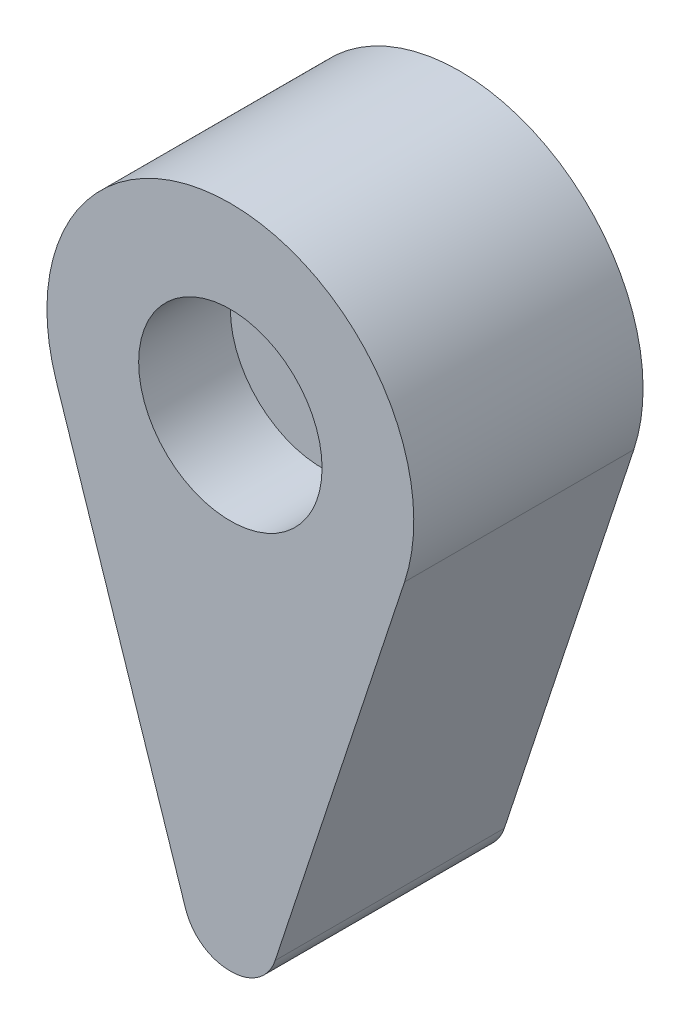
ISO-10303-21;
HEADER;
FILE_DESCRIPTION(('STEP AP214'),'2;1');
FILE_NAME('part.step','',(''),(''),'','','');
FILE_SCHEMA(('AUTOMOTIVE_DESIGN { 1 0 10303 214 1 1 1 1 }'));
ENDSEC;
DATA;
#1=APPLICATION_CONTEXT('core data for automotive mechanical design processes');
#2=APPLICATION_PROTOCOL_DEFINITION('international standard','automotive_design',2000,#1);
#3=PRODUCT_CONTEXT('',#1,'mechanical');
#4=PRODUCT('Part','Part','',(#3));
#5=PRODUCT_RELATED_PRODUCT_CATEGORY('part','',(#4));
#6=PRODUCT_DEFINITION_FORMATION('','',#4);
#7=PRODUCT_DEFINITION_CONTEXT('part definition',#1,'design');
#8=PRODUCT_DEFINITION('design','',#6,#7);
#9=PRODUCT_DEFINITION_SHAPE('','',#8);
#10=(LENGTH_UNIT() NAMED_UNIT(*) SI_UNIT(.MILLI.,.METRE.));
#11=(NAMED_UNIT(*) PLANE_ANGLE_UNIT() SI_UNIT($,.RADIAN.));
#12=(NAMED_UNIT(*) SI_UNIT($,.STERADIAN.) SOLID_ANGLE_UNIT());
#13=UNCERTAINTY_MEASURE_WITH_UNIT(LENGTH_MEASURE(1.E-05),#10,'distance_accuracy_value','');
#14=(GEOMETRIC_REPRESENTATION_CONTEXT(3) GLOBAL_UNCERTAINTY_ASSIGNED_CONTEXT((#13)) GLOBAL_UNIT_ASSIGNED_CONTEXT((#10,
#11,#12)) REPRESENTATION_CONTEXT('',''));
#15=CARTESIAN_POINT('',(0.,0.,0.));
#16=DIRECTION('',(0.,0.,1.));
#17=DIRECTION('',(1.,0.,0.));
#18=AXIS2_PLACEMENT_3D('',#15,#16,#17);
#19=CARTESIAN_POINT('',(-1.5,-21.,10.));
#20=DIRECTION('',(0.,1.,0.));
#21=DIRECTION('',(0.,0.,1.));
#22=AXIS2_PLACEMENT_3D('',#19,#20,#21);
#23=PLANE('',#22);
#24=DIRECTION('',(1.,0.,0.));
#25=VECTOR('',#24,1.);
#26=CARTESIAN_POINT('',(-1.5,-21.,0.));
#27=LINE('',#26,#25);
#28=CARTESIAN_POINT('',(-0.053493648679276,-21.,0.));
#29=VERTEX_POINT('',#28);
#30=CARTESIAN_POINT('',(0.0534936486792851,-21.,0.));
#31=VERTEX_POINT('',#30);
#32=EDGE_CURVE('E118',#29,#31,#27,.T.);
#33=ORIENTED_EDGE('',*,*,#32,.T.);
#34=DIRECTION('',(0.,0.,-1.));
#35=VECTOR('',#34,1.);
#36=CARTESIAN_POINT('',(0.0534936486792851,-21.,10.));
#37=LINE('',#36,#35);
#38=CARTESIAN_POINT('',(0.0534936486792851,-21.,10.));
#39=VERTEX_POINT('',#38);
#40=EDGE_CURVE('E56',#31,#39,#37,.F.);
#41=ORIENTED_EDGE('',*,*,#40,.T.);
#42=DIRECTION('',(1.,0.,0.));
#43=VECTOR('',#42,1.);
#44=CARTESIAN_POINT('',(-1.5,-21.,10.));
#45=LINE('',#44,#43);
#46=CARTESIAN_POINT('',(-0.053493648679276,-21.,10.));
#47=VERTEX_POINT('',#46);
#48=EDGE_CURVE('E99',#47,#39,#45,.T.);
#49=ORIENTED_EDGE('',*,*,#48,.F.);
#50=DIRECTION('',(0.,0.,-1.));
#51=VECTOR('',#50,1.);
#52=CARTESIAN_POINT('',(-0.053493648679276,-21.,10.));
#53=LINE('',#52,#51);
#54=EDGE_CURVE('E132',#47,#29,#53,.T.);
#55=ORIENTED_EDGE('',*,*,#54,.T.);
#56=EDGE_LOOP('',(#33,#41,#49,#55));
#57=FACE_BOUND('',#56,.T.);
#58=ADVANCED_FACE('F35',(#57),#23,.F.);
#59=CARTESIAN_POINT('',(1.5,-21.,10.));
#60=DIRECTION('',(-0.949715023073118,0.313115593590015,0.));
#61=DIRECTION('',(-0.313115593590015,-0.949715023073118,0.));
#62=AXIS2_PLACEMENT_3D('',#59,#60,#61);
#63=PLANE('',#62);
#64=DIRECTION('',(0.313115593590015,0.949715023073118,0.));
#65=VECTOR('',#64,1.);
#66=CARTESIAN_POINT('',(1.5,-21.,10.));
#67=LINE('',#66,#65);
#68=CARTESIAN_POINT('',(1.95292369482552,-19.62623118718,10.));
#69=VERTEX_POINT('',#68);
#70=CARTESIAN_POINT('',(7.59772018458495,-2.50492474872012,10.));
#71=VERTEX_POINT('',#70);
#72=EDGE_CURVE('E89',#69,#71,#67,.T.);
#73=ORIENTED_EDGE('',*,*,#72,.F.);
#74=DIRECTION('',(0.,0.,-1.));
#75=VECTOR('',#74,1.);
#76=CARTESIAN_POINT('',(1.95292369482552,-19.62623118718,10.));
#77=LINE('',#76,#75);
#78=CARTESIAN_POINT('',(1.95292369482552,-19.62623118718,0.));
#79=VERTEX_POINT('',#78);
#80=EDGE_CURVE('E108',#69,#79,#77,.T.);
#81=ORIENTED_EDGE('',*,*,#80,.T.);
#82=DIRECTION('',(0.313115593590015,0.949715023073118,0.));
#83=VECTOR('',#82,1.);
#84=CARTESIAN_POINT('',(1.5,-21.,0.));
#85=LINE('',#84,#83);
#86=CARTESIAN_POINT('',(7.59772018458495,-2.50492474872012,0.));
#87=VERTEX_POINT('',#86);
#88=EDGE_CURVE('E105',#79,#87,#85,.T.);
#89=ORIENTED_EDGE('',*,*,#88,.T.);
#90=DIRECTION('',(0.,0.,-1.));
#91=VECTOR('',#90,1.);
#92=CARTESIAN_POINT('',(7.59772018458495,-2.50492474872012,10.));
#93=LINE('',#92,#91);
#94=EDGE_CURVE('E102',#71,#87,#93,.T.);
#95=ORIENTED_EDGE('',*,*,#94,.F.);
#96=EDGE_LOOP('',(#73,#81,#89,#95));
#97=FACE_BOUND('',#96,.T.);
#98=ADVANCED_FACE('F103',(#97),#63,.F.);
#99=CARTESIAN_POINT('',(0.,0.,10.));
#100=DIRECTION('',(0.,0.,-1.));
#101=DIRECTION('',(-1.,0.,0.));
#102=AXIS2_PLACEMENT_3D('',#99,#100,#101);
#103=CYLINDRICAL_SURFACE('',#102,8.);
#104=CARTESIAN_POINT('',(0.,0.,0.));
#105=DIRECTION('',(0.,0.,1.));
#106=DIRECTION('',(1.,0.,0.));
#107=AXIS2_PLACEMENT_3D('',#104,#105,#106);
#108=CIRCLE('',#107,8.);
#109=CARTESIAN_POINT('',(-7.59772018458494,-2.50492474872013,0.));
#110=VERTEX_POINT('',#109);
#111=EDGE_CURVE('E122',#87,#110,#108,.T.);
#112=ORIENTED_EDGE('',*,*,#111,.T.);
#113=DIRECTION('',(0.,0.,-1.));
#114=VECTOR('',#113,1.);
#115=CARTESIAN_POINT('',(-7.59772018458494,-2.50492474872013,10.));
#116=LINE('',#115,#114);
#117=CARTESIAN_POINT('',(-7.59772018458494,-2.50492474872013,10.));
#118=VERTEX_POINT('',#117);
#119=EDGE_CURVE('E109',#118,#110,#116,.T.);
#120=ORIENTED_EDGE('',*,*,#119,.F.);
#121=CARTESIAN_POINT('',(0.,0.,10.));
#122=DIRECTION('',(0.,0.,1.));
#123=DIRECTION('',(1.,0.,0.));
#124=AXIS2_PLACEMENT_3D('',#121,#122,#123);
#125=CIRCLE('',#124,8.);
#126=EDGE_CURVE('E93',#71,#118,#125,.T.);
#127=ORIENTED_EDGE('',*,*,#126,.F.);
#128=ORIENTED_EDGE('',*,*,#94,.T.);
#129=EDGE_LOOP('',(#112,#120,#127,#128));
#130=FACE_BOUND('',#129,.T.);
#131=ADVANCED_FACE('F111',(#130),#103,.T.);
#132=CARTESIAN_POINT('',(-1.5,-21.,10.));
#133=DIRECTION('',(0.949715023073118,0.313115593590016,0.));
#134=DIRECTION('',(-0.313115593590016,0.949715023073118,0.));
#135=AXIS2_PLACEMENT_3D('',#132,#133,#134);
#136=PLANE('',#135);
#137=DIRECTION('',(0.313115593590016,-0.949715023073118,0.));
#138=VECTOR('',#137,1.);
#139=CARTESIAN_POINT('',(-1.5,-21.,0.));
#140=LINE('',#139,#138);
#141=CARTESIAN_POINT('',(-1.95292369482551,-19.62623118718,0.));
#142=VERTEX_POINT('',#141);
#143=EDGE_CURVE('E124',#110,#142,#140,.T.);
#144=ORIENTED_EDGE('',*,*,#143,.T.);
#145=DIRECTION('',(0.,0.,-1.));
#146=VECTOR('',#145,1.);
#147=CARTESIAN_POINT('',(-1.95292369482551,-19.62623118718,10.));
#148=LINE('',#147,#146);
#149=CARTESIAN_POINT('',(-1.95292369482551,-19.62623118718,10.));
#150=VERTEX_POINT('',#149);
#151=EDGE_CURVE('E11',#142,#150,#148,.F.);
#152=ORIENTED_EDGE('',*,*,#151,.T.);
#153=DIRECTION('',(0.313115593590016,-0.949715023073118,0.));
#154=VECTOR('',#153,1.);
#155=CARTESIAN_POINT('',(-1.5,-21.,10.));
#156=LINE('',#155,#154);
#157=EDGE_CURVE('E113',#118,#150,#156,.T.);
#158=ORIENTED_EDGE('',*,*,#157,.F.);
#159=ORIENTED_EDGE('',*,*,#119,.T.);
#160=EDGE_LOOP('',(#144,#152,#158,#159));
#161=FACE_BOUND('',#160,.T.);
#162=ADVANCED_FACE('F144',(#161),#136,.F.);
#163=CARTESIAN_POINT('',(0.,0.,10.));
#164=DIRECTION('',(0.,0.,1.));
#165=DIRECTION('',(1.,0.,0.));
#166=AXIS2_PLACEMENT_3D('',#163,#164,#165);
#167=PLANE('',#166);
#168=CARTESIAN_POINT('',(0.,0.,10.));
#169=DIRECTION('',(0.,0.,1.));
#170=DIRECTION('',(1.,0.,0.));
#171=AXIS2_PLACEMENT_3D('',#168,#169,#170);
#172=CIRCLE('',#171,4.);
#173=CARTESIAN_POINT('',(4.,0.,10.));
#174=VERTEX_POINT('',#173);
#175=EDGE_CURVE('E193',#174,#174,#172,.T.);
#176=ORIENTED_EDGE('',*,*,#175,.F.);
#177=EDGE_LOOP('',(#176));
#178=FACE_BOUND('',#177,.T.);
#179=ORIENTED_EDGE('',*,*,#48,.T.);
#180=CARTESIAN_POINT('',(0.0534936486792852,-19.,10.));
#181=DIRECTION('',(0.,0.,1.));
#182=DIRECTION('',(1.,0.,0.));
#183=AXIS2_PLACEMENT_3D('',#180,#181,#182);
#184=CIRCLE('',#183,2.);
#185=EDGE_CURVE('E43',#39,#69,#184,.T.);
#186=ORIENTED_EDGE('',*,*,#185,.T.);
#187=ORIENTED_EDGE('',*,*,#72,.T.);
#188=ORIENTED_EDGE('',*,*,#126,.T.);
#189=ORIENTED_EDGE('',*,*,#157,.T.);
#190=CARTESIAN_POINT('',(-0.053493648679276,-19.,10.));
#191=DIRECTION('',(0.,0.,1.));
#192=DIRECTION('',(1.,0.,0.));
#193=AXIS2_PLACEMENT_3D('',#190,#191,#192);
#194=CIRCLE('',#193,2.);
#195=EDGE_CURVE('E136',#150,#47,#194,.T.);
#196=ORIENTED_EDGE('',*,*,#195,.T.);
#197=EDGE_LOOP('',(#179,#186,#187,#188,#189,#196));
#198=FACE_BOUND('',#197,.T.);
#199=ADVANCED_FACE('F91',(#178,#198),#167,.T.);
#200=CARTESIAN_POINT('',(0.,0.,0.));
#201=DIRECTION('',(0.,0.,1.));
#202=DIRECTION('',(1.,0.,0.));
#203=AXIS2_PLACEMENT_3D('',#200,#201,#202);
#204=PLANE('',#203);
#205=CARTESIAN_POINT('',(0.,0.,0.));
#206=DIRECTION('',(0.,0.,1.));
#207=DIRECTION('',(1.,0.,0.));
#208=AXIS2_PLACEMENT_3D('',#205,#206,#207);
#209=CIRCLE('',#208,1.65);
#210=CARTESIAN_POINT('',(1.65,0.,0.));
#211=VERTEX_POINT('',#210);
#212=EDGE_CURVE('E188',#211,#211,#209,.T.);
#213=ORIENTED_EDGE('',*,*,#212,.T.);
#214=EDGE_LOOP('',(#213));
#215=FACE_BOUND('',#214,.T.);
#216=ORIENTED_EDGE('',*,*,#88,.F.);
#217=CARTESIAN_POINT('',(0.0534936486792852,-19.,0.));
#218=DIRECTION('',(0.,0.,1.));
#219=DIRECTION('',(1.,0.,0.));
#220=AXIS2_PLACEMENT_3D('',#217,#218,#219);
#221=CIRCLE('',#220,2.);
#222=EDGE_CURVE('E130',#79,#31,#221,.F.);
#223=ORIENTED_EDGE('',*,*,#222,.T.);
#224=ORIENTED_EDGE('',*,*,#32,.F.);
#225=CARTESIAN_POINT('',(-0.053493648679276,-19.,0.));
#226=DIRECTION('',(0.,0.,1.));
#227=DIRECTION('',(1.,0.,0.));
#228=AXIS2_PLACEMENT_3D('',#225,#226,#227);
#229=CIRCLE('',#228,2.);
#230=EDGE_CURVE('E128',#29,#142,#229,.F.);
#231=ORIENTED_EDGE('',*,*,#230,.T.);
#232=ORIENTED_EDGE('',*,*,#143,.F.);
#233=ORIENTED_EDGE('',*,*,#111,.F.);
#234=EDGE_LOOP('',(#216,#223,#224,#231,#232,#233));
#235=FACE_BOUND('',#234,.T.);
#236=ADVANCED_FACE('F143',(#215,#235),#204,.F.);
#237=CARTESIAN_POINT('',(0.0534936486792852,-19.,10.));
#238=DIRECTION('',(0.,0.,-1.));
#239=DIRECTION('',(-1.,0.,0.));
#240=AXIS2_PLACEMENT_3D('',#237,#238,#239);
#241=CYLINDRICAL_SURFACE('',#240,2.);
#242=ORIENTED_EDGE('',*,*,#185,.F.);
#243=ORIENTED_EDGE('',*,*,#40,.F.);
#244=ORIENTED_EDGE('',*,*,#222,.F.);
#245=ORIENTED_EDGE('',*,*,#80,.F.);
#246=EDGE_LOOP('',(#242,#243,#244,#245));
#247=FACE_BOUND('',#246,.T.);
#248=ADVANCED_FACE('F161',(#247),#241,.T.);
#249=CARTESIAN_POINT('',(-0.053493648679276,-19.,10.));
#250=DIRECTION('',(0.,0.,-1.));
#251=DIRECTION('',(-1.,0.,0.));
#252=AXIS2_PLACEMENT_3D('',#249,#250,#251);
#253=CYLINDRICAL_SURFACE('',#252,2.);
#254=ORIENTED_EDGE('',*,*,#195,.F.);
#255=ORIENTED_EDGE('',*,*,#151,.F.);
#256=ORIENTED_EDGE('',*,*,#230,.F.);
#257=ORIENTED_EDGE('',*,*,#54,.F.);
#258=EDGE_LOOP('',(#254,#255,#256,#257));
#259=FACE_BOUND('',#258,.T.);
#260=ADVANCED_FACE('F37',(#259),#253,.T.);
#261=CARTESIAN_POINT('',(0.,0.,6.));
#262=DIRECTION('',(0.,0.,1.));
#263=DIRECTION('',(1.,0.,0.));
#264=AXIS2_PLACEMENT_3D('',#261,#262,#263);
#265=CYLINDRICAL_SURFACE('',#264,4.);
#266=CARTESIAN_POINT('',(0.,0.,6.));
#267=DIRECTION('',(0.,0.,1.));
#268=DIRECTION('',(1.,0.,0.));
#269=AXIS2_PLACEMENT_3D('',#266,#267,#268);
#270=CIRCLE('',#269,4.);
#271=CARTESIAN_POINT('',(4.,0.,6.));
#272=VERTEX_POINT('',#271);
#273=EDGE_CURVE('E120',#272,#272,#270,.T.);
#274=ORIENTED_EDGE('',*,*,#273,.F.);
#275=EDGE_LOOP('',(#274));
#276=FACE_BOUND('',#275,.T.);
#277=ORIENTED_EDGE('',*,*,#175,.T.);
#278=EDGE_LOOP('',(#277));
#279=FACE_BOUND('',#278,.T.);
#280=ADVANCED_FACE('F168',(#276,#279),#265,.F.);
#281=CARTESIAN_POINT('',(0.,0.,6.));
#282=DIRECTION('',(0.,0.,1.));
#283=DIRECTION('',(1.,0.,0.));
#284=AXIS2_PLACEMENT_3D('',#281,#282,#283);
#285=PLANE('',#284);
#286=CARTESIAN_POINT('',(0.,0.,6.));
#287=DIRECTION('',(0.,0.,1.));
#288=DIRECTION('',(1.,0.,0.));
#289=AXIS2_PLACEMENT_3D('',#286,#287,#288);
#290=CIRCLE('',#289,1.64999999999999);
#291=CARTESIAN_POINT('',(1.64999999999999,0.,6.));
#292=VERTEX_POINT('',#291);
#293=EDGE_CURVE('E191',#292,#292,#290,.T.);
#294=ORIENTED_EDGE('',*,*,#293,.F.);
#295=EDGE_LOOP('',(#294));
#296=FACE_BOUND('',#295,.T.);
#297=ORIENTED_EDGE('',*,*,#273,.T.);
#298=EDGE_LOOP('',(#297));
#299=FACE_BOUND('',#298,.T.);
#300=ADVANCED_FACE('F176',(#296,#299),#285,.T.);
#301=CARTESIAN_POINT('',(0.,0.,6.));
#302=DIRECTION('',(0.,0.,1.));
#303=DIRECTION('',(1.,0.,0.));
#304=AXIS2_PLACEMENT_3D('',#301,#302,#303);
#305=CYLINDRICAL_SURFACE('',#304,1.64999999999999);
#306=ORIENTED_EDGE('',*,*,#212,.F.);
#307=EDGE_LOOP('',(#306));
#308=FACE_BOUND('',#307,.T.);
#309=ORIENTED_EDGE('',*,*,#293,.T.);
#310=EDGE_LOOP('',(#309));
#311=FACE_BOUND('',#310,.T.);
#312=ADVANCED_FACE('F180',(#308,#311),#305,.F.);
#313=CLOSED_SHELL('',(#58,#98,#131,#162,#199,#236,#248,#260,#280,#300,#312));
#314=MANIFOLD_SOLID_BREP('B2',#313);
#315=ADVANCED_BREP_SHAPE_REPRESENTATION('',(#18,#314),#14);
#316=SHAPE_DEFINITION_REPRESENTATION(#9,#315);
ENDSEC;
END-ISO-10303-21;
